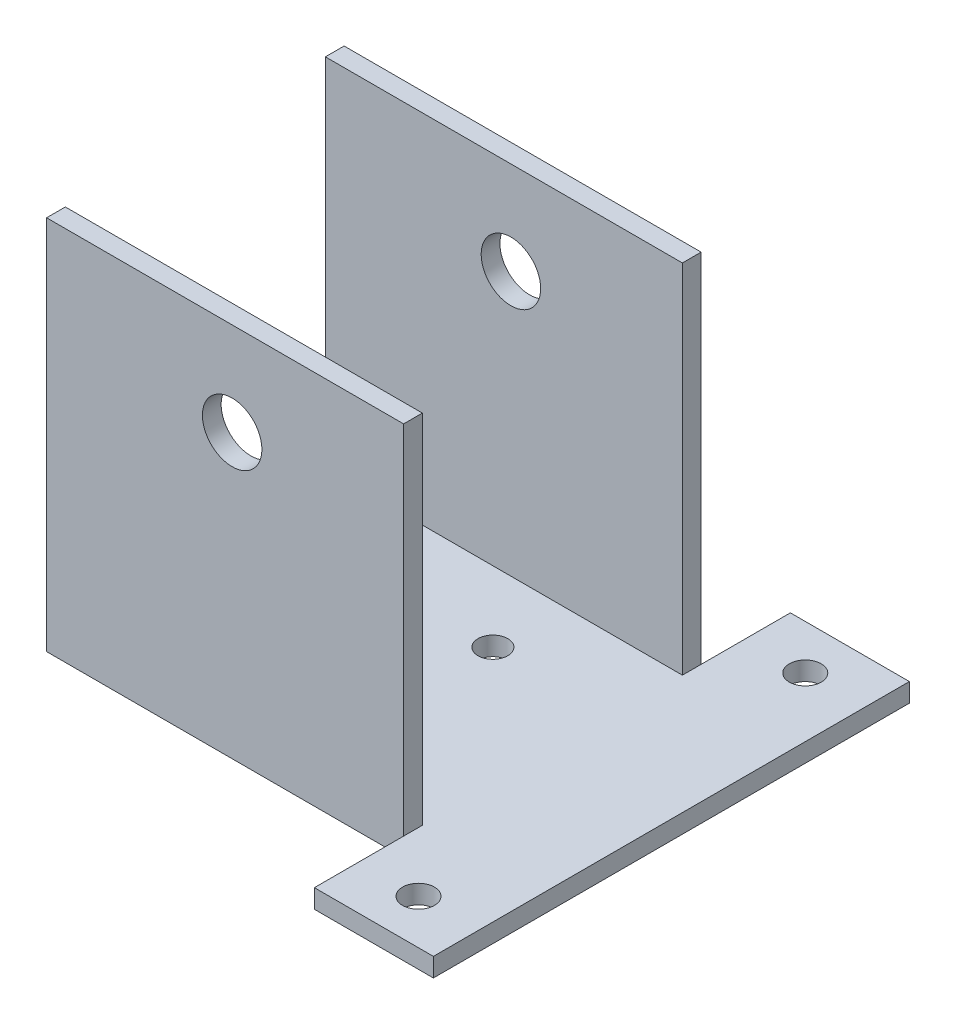
ISO-10303-21;
HEADER;
FILE_DESCRIPTION(('STEP AP214'),'2;1');
FILE_NAME('part.step','',(''),(''),'','','');
FILE_SCHEMA(('AUTOMOTIVE_DESIGN { 1 0 10303 214 1 1 1 1 }'));
ENDSEC;
DATA;
#1=APPLICATION_CONTEXT('core data for automotive mechanical design processes');
#2=APPLICATION_PROTOCOL_DEFINITION('international standard','automotive_design',2000,#1);
#3=PRODUCT_CONTEXT('',#1,'mechanical');
#4=PRODUCT('Part','Part','',(#3));
#5=PRODUCT_RELATED_PRODUCT_CATEGORY('part','',(#4));
#6=PRODUCT_DEFINITION_FORMATION('','',#4);
#7=PRODUCT_DEFINITION_CONTEXT('part definition',#1,'design');
#8=PRODUCT_DEFINITION('design','',#6,#7);
#9=PRODUCT_DEFINITION_SHAPE('','',#8);
#10=(LENGTH_UNIT() NAMED_UNIT(*) SI_UNIT(.MILLI.,.METRE.));
#11=(NAMED_UNIT(*) PLANE_ANGLE_UNIT() SI_UNIT($,.RADIAN.));
#12=(NAMED_UNIT(*) SI_UNIT($,.STERADIAN.) SOLID_ANGLE_UNIT());
#13=UNCERTAINTY_MEASURE_WITH_UNIT(LENGTH_MEASURE(1.E-05),#10,'distance_accuracy_value','');
#14=(GEOMETRIC_REPRESENTATION_CONTEXT(3) GLOBAL_UNCERTAINTY_ASSIGNED_CONTEXT((#13)) GLOBAL_UNIT_ASSIGNED_CONTEXT((#10,
#11,#12)) REPRESENTATION_CONTEXT('',''));
#15=CARTESIAN_POINT('',(0.,0.,0.));
#16=DIRECTION('',(0.,0.,1.));
#17=DIRECTION('',(1.,0.,0.));
#18=AXIS2_PLACEMENT_3D('',#15,#16,#17);
#19=CARTESIAN_POINT('',(0.,2.,0.));
#20=DIRECTION('',(0.,-1.,0.));
#21=DIRECTION('',(0.,0.,-1.));
#22=AXIS2_PLACEMENT_3D('',#19,#20,#21);
#23=PLANE('',#22);
#24=CARTESIAN_POINT('',(19.05,2.,-20.6375));
#25=DIRECTION('',(0.,1.,0.));
#26=DIRECTION('',(0.,0.,1.));
#27=AXIS2_PLACEMENT_3D('',#24,#25,#26);
#28=CIRCLE('',#27,1.7);
#29=CARTESIAN_POINT('',(19.05,2.,-18.9375));
#30=VERTEX_POINT('',#29);
#31=EDGE_CURVE('E248',#30,#30,#28,.T.);
#32=ORIENTED_EDGE('',*,*,#31,.F.);
#33=EDGE_LOOP('',(#32));
#34=FACE_BOUND('',#33,.T.);
#35=CARTESIAN_POINT('',(19.05,2.,20.6375));
#36=DIRECTION('',(0.,1.,0.));
#37=DIRECTION('',(0.,0.,1.));
#38=AXIS2_PLACEMENT_3D('',#35,#36,#37);
#39=CIRCLE('',#38,1.7);
#40=CARTESIAN_POINT('',(19.05,2.,22.3375));
#41=VERTEX_POINT('',#40);
#42=EDGE_CURVE('E240',#41,#41,#39,.T.);
#43=ORIENTED_EDGE('',*,*,#42,.F.);
#44=EDGE_LOOP('',(#43));
#45=FACE_BOUND('',#44,.T.);
#46=CARTESIAN_POINT('',(0.,2.,-6.35));
#47=DIRECTION('',(0.,1.,0.));
#48=DIRECTION('',(0.,0.,1.));
#49=AXIS2_PLACEMENT_3D('',#46,#47,#48);
#50=CIRCLE('',#49,1.5875);
#51=CARTESIAN_POINT('',(0.,2.,-4.7625));
#52=VERTEX_POINT('',#51);
#53=EDGE_CURVE('E232',#52,#52,#50,.T.);
#54=ORIENTED_EDGE('',*,*,#53,.F.);
#55=EDGE_LOOP('',(#54));
#56=FACE_BOUND('',#55,.T.);
#57=CARTESIAN_POINT('',(0.,2.,6.35));
#58=DIRECTION('',(0.,1.,0.));
#59=DIRECTION('',(0.,0.,1.));
#60=AXIS2_PLACEMENT_3D('',#57,#58,#59);
#61=CIRCLE('',#60,1.5875);
#62=CARTESIAN_POINT('',(0.,2.,7.9375));
#63=VERTEX_POINT('',#62);
#64=EDGE_CURVE('E224',#63,#63,#61,.T.);
#65=ORIENTED_EDGE('',*,*,#64,.F.);
#66=EDGE_LOOP('',(#65));
#67=FACE_BOUND('',#66,.T.);
#68=DIRECTION('',(0.,0.,-1.));
#69=VECTOR('',#68,1.);
#70=CARTESIAN_POINT('',(12.7,2.,15.875));
#71=LINE('',#70,#69);
#72=CARTESIAN_POINT('',(12.7,2.,15.875));
#73=VERTEX_POINT('',#72);
#74=CARTESIAN_POINT('',(12.7,2.,13.875));
#75=VERTEX_POINT('',#74);
#76=EDGE_CURVE('E168',#73,#75,#71,.T.);
#77=ORIENTED_EDGE('',*,*,#76,.F.);
#78=DIRECTION('',(0.,0.,1.));
#79=VECTOR('',#78,1.);
#80=CARTESIAN_POINT('',(12.7,2.,25.4));
#81=LINE('',#80,#79);
#82=CARTESIAN_POINT('',(12.7,2.,25.4));
#83=VERTEX_POINT('',#82);
#84=EDGE_CURVE('E266',#73,#83,#81,.T.);
#85=ORIENTED_EDGE('',*,*,#84,.T.);
#86=DIRECTION('',(1.,0.,0.));
#87=VECTOR('',#86,1.);
#88=CARTESIAN_POINT('',(25.4,2.,25.4));
#89=LINE('',#88,#87);
#90=CARTESIAN_POINT('',(25.4,2.,25.4));
#91=VERTEX_POINT('',#90);
#92=EDGE_CURVE('E269',#83,#91,#89,.T.);
#93=ORIENTED_EDGE('',*,*,#92,.T.);
#94=DIRECTION('',(0.,0.,-1.));
#95=VECTOR('',#94,1.);
#96=CARTESIAN_POINT('',(25.4,2.,-25.4));
#97=LINE('',#96,#95);
#98=CARTESIAN_POINT('',(25.4,2.,-25.4));
#99=VERTEX_POINT('',#98);
#100=EDGE_CURVE('E272',#91,#99,#97,.T.);
#101=ORIENTED_EDGE('',*,*,#100,.T.);
#102=DIRECTION('',(-1.,0.,0.));
#103=VECTOR('',#102,1.);
#104=CARTESIAN_POINT('',(12.7,2.,-25.4));
#105=LINE('',#104,#103);
#106=CARTESIAN_POINT('',(12.7,2.,-25.4));
#107=VERTEX_POINT('',#106);
#108=EDGE_CURVE('E256',#99,#107,#105,.T.);
#109=ORIENTED_EDGE('',*,*,#108,.T.);
#110=DIRECTION('',(0.,0.,1.));
#111=VECTOR('',#110,1.);
#112=CARTESIAN_POINT('',(12.7,2.,-15.875));
#113=LINE('',#112,#111);
#114=CARTESIAN_POINT('',(12.7,2.,-15.875));
#115=VERTEX_POINT('',#114);
#116=EDGE_CURVE('E260',#107,#115,#113,.T.);
#117=ORIENTED_EDGE('',*,*,#116,.T.);
#118=DIRECTION('',(0.,0.,-1.));
#119=VECTOR('',#118,1.);
#120=CARTESIAN_POINT('',(12.7,2.,-15.875));
#121=LINE('',#120,#119);
#122=CARTESIAN_POINT('',(12.7,2.,-13.875));
#123=VERTEX_POINT('',#122);
#124=EDGE_CURVE('E195',#123,#115,#121,.T.);
#125=ORIENTED_EDGE('',*,*,#124,.F.);
#126=DIRECTION('',(1.,0.,0.));
#127=VECTOR('',#126,1.);
#128=CARTESIAN_POINT('',(-25.4,2.,-13.875));
#129=LINE('',#128,#127);
#130=CARTESIAN_POINT('',(-25.4,2.,-13.875));
#131=VERTEX_POINT('',#130);
#132=EDGE_CURVE('E189',#131,#123,#129,.T.);
#133=ORIENTED_EDGE('',*,*,#132,.F.);
#134=DIRECTION('',(0.,0.,1.));
#135=VECTOR('',#134,1.);
#136=CARTESIAN_POINT('',(-25.4,2.,15.875));
#137=LINE('',#136,#135);
#138=CARTESIAN_POINT('',(-25.4,2.,13.875));
#139=VERTEX_POINT('',#138);
#140=EDGE_CURVE('E61',#131,#139,#137,.T.);
#141=ORIENTED_EDGE('',*,*,#140,.T.);
#142=DIRECTION('',(-1.,0.,0.));
#143=VECTOR('',#142,1.);
#144=CARTESIAN_POINT('',(-25.4,2.,13.875));
#145=LINE('',#144,#143);
#146=EDGE_CURVE('E56',#75,#139,#145,.T.);
#147=ORIENTED_EDGE('',*,*,#146,.F.);
#148=EDGE_LOOP('',(#77,#85,#93,#101,#109,#117,#125,#133,#141,#147));
#149=FACE_BOUND('',#148,.T.);
#150=ADVANCED_FACE('F39',(#34,#45,#56,#67,#149),#23,.F.);
#151=CARTESIAN_POINT('',(0.,0.,0.));
#152=DIRECTION('',(0.,-1.,0.));
#153=DIRECTION('',(0.,0.,-1.));
#154=AXIS2_PLACEMENT_3D('',#151,#152,#153);
#155=PLANE('',#154);
#156=CARTESIAN_POINT('',(0.,0.,-6.35));
#157=DIRECTION('',(0.,1.,0.));
#158=DIRECTION('',(0.,0.,1.));
#159=AXIS2_PLACEMENT_3D('',#156,#157,#158);
#160=CIRCLE('',#159,1.5875);
#161=CARTESIAN_POINT('',(0.,0.,-4.7625));
#162=VERTEX_POINT('',#161);
#163=EDGE_CURVE('E228',#162,#162,#160,.T.);
#164=ORIENTED_EDGE('',*,*,#163,.T.);
#165=EDGE_LOOP('',(#164));
#166=FACE_BOUND('',#165,.T.);
#167=CARTESIAN_POINT('',(19.05,0.,-20.6375));
#168=DIRECTION('',(0.,1.,0.));
#169=DIRECTION('',(0.,0.,1.));
#170=AXIS2_PLACEMENT_3D('',#167,#168,#169);
#171=CIRCLE('',#170,1.7);
#172=CARTESIAN_POINT('',(19.05,0.,-18.9375));
#173=VERTEX_POINT('',#172);
#174=EDGE_CURVE('E244',#173,#173,#171,.T.);
#175=ORIENTED_EDGE('',*,*,#174,.T.);
#176=EDGE_LOOP('',(#175));
#177=FACE_BOUND('',#176,.T.);
#178=DIRECTION('',(-1.,0.,0.));
#179=VECTOR('',#178,1.);
#180=CARTESIAN_POINT('',(12.7,0.,-25.4));
#181=LINE('',#180,#179);
#182=CARTESIAN_POINT('',(25.4,0.,-25.4));
#183=VERTEX_POINT('',#182);
#184=CARTESIAN_POINT('',(12.7,0.,-25.4));
#185=VERTEX_POINT('',#184);
#186=EDGE_CURVE('E252',#183,#185,#181,.T.);
#187=ORIENTED_EDGE('',*,*,#186,.F.);
#188=DIRECTION('',(0.,0.,-1.));
#189=VECTOR('',#188,1.);
#190=CARTESIAN_POINT('',(25.4,0.,-25.4));
#191=LINE('',#190,#189);
#192=CARTESIAN_POINT('',(25.4,0.,25.4));
#193=VERTEX_POINT('',#192);
#194=EDGE_CURVE('E261',#193,#183,#191,.T.);
#195=ORIENTED_EDGE('',*,*,#194,.F.);
#196=DIRECTION('',(1.,0.,0.));
#197=VECTOR('',#196,1.);
#198=CARTESIAN_POINT('',(25.4,0.,25.4));
#199=LINE('',#198,#197);
#200=CARTESIAN_POINT('',(12.7,0.,25.4));
#201=VERTEX_POINT('',#200);
#202=EDGE_CURVE('E293',#201,#193,#199,.T.);
#203=ORIENTED_EDGE('',*,*,#202,.F.);
#204=DIRECTION('',(0.,0.,1.));
#205=VECTOR('',#204,1.);
#206=CARTESIAN_POINT('',(12.7,0.,25.4));
#207=LINE('',#206,#205);
#208=CARTESIAN_POINT('',(12.7,0.,15.875));
#209=VERTEX_POINT('',#208);
#210=EDGE_CURVE('E290',#209,#201,#207,.T.);
#211=ORIENTED_EDGE('',*,*,#210,.F.);
#212=DIRECTION('',(1.,0.,0.));
#213=VECTOR('',#212,1.);
#214=CARTESIAN_POINT('',(12.7,0.,15.875));
#215=LINE('',#214,#213);
#216=CARTESIAN_POINT('',(-25.4,0.,15.875));
#217=VERTEX_POINT('',#216);
#218=EDGE_CURVE('E287',#217,#209,#215,.T.);
#219=ORIENTED_EDGE('',*,*,#218,.F.);
#220=DIRECTION('',(0.,0.,1.));
#221=VECTOR('',#220,1.);
#222=CARTESIAN_POINT('',(-25.4,0.,15.875));
#223=LINE('',#222,#221);
#224=CARTESIAN_POINT('',(-25.4,0.,-15.875));
#225=VERTEX_POINT('',#224);
#226=EDGE_CURVE('E143',#225,#217,#223,.T.);
#227=ORIENTED_EDGE('',*,*,#226,.F.);
#228=DIRECTION('',(-1.,0.,0.));
#229=VECTOR('',#228,1.);
#230=CARTESIAN_POINT('',(-25.4,0.,-15.875));
#231=LINE('',#230,#229);
#232=CARTESIAN_POINT('',(12.7,0.,-15.875));
#233=VERTEX_POINT('',#232);
#234=EDGE_CURVE('E282',#233,#225,#231,.T.);
#235=ORIENTED_EDGE('',*,*,#234,.F.);
#236=DIRECTION('',(0.,0.,1.));
#237=VECTOR('',#236,1.);
#238=CARTESIAN_POINT('',(12.7,0.,-15.875));
#239=LINE('',#238,#237);
#240=EDGE_CURVE('E279',#185,#233,#239,.T.);
#241=ORIENTED_EDGE('',*,*,#240,.F.);
#242=EDGE_LOOP('',(#187,#195,#203,#211,#219,#227,#235,#241));
#243=FACE_BOUND('',#242,.T.);
#244=CARTESIAN_POINT('',(19.05,0.,20.6375));
#245=DIRECTION('',(0.,1.,0.));
#246=DIRECTION('',(0.,0.,1.));
#247=AXIS2_PLACEMENT_3D('',#244,#245,#246);
#248=CIRCLE('',#247,1.7);
#249=CARTESIAN_POINT('',(19.05,0.,22.3375));
#250=VERTEX_POINT('',#249);
#251=EDGE_CURVE('E236',#250,#250,#248,.T.);
#252=ORIENTED_EDGE('',*,*,#251,.T.);
#253=EDGE_LOOP('',(#252));
#254=FACE_BOUND('',#253,.T.);
#255=CARTESIAN_POINT('',(0.,0.,6.35));
#256=DIRECTION('',(0.,1.,0.));
#257=DIRECTION('',(0.,0.,1.));
#258=AXIS2_PLACEMENT_3D('',#255,#256,#257);
#259=CIRCLE('',#258,1.5875);
#260=CARTESIAN_POINT('',(0.,0.,7.9375));
#261=VERTEX_POINT('',#260);
#262=EDGE_CURVE('E223',#261,#261,#259,.T.);
#263=ORIENTED_EDGE('',*,*,#262,.T.);
#264=EDGE_LOOP('',(#263));
#265=FACE_BOUND('',#264,.T.);
#266=ADVANCED_FACE('F325',(#166,#177,#243,#254,#265),#155,.T.);
#267=CARTESIAN_POINT('',(12.7,2.,-25.4));
#268=DIRECTION('',(0.,0.,1.));
#269=DIRECTION('',(1.,0.,0.));
#270=AXIS2_PLACEMENT_3D('',#267,#268,#269);
#271=PLANE('',#270);
#272=ORIENTED_EDGE('',*,*,#186,.T.);
#273=DIRECTION('',(0.,-1.,0.));
#274=VECTOR('',#273,1.);
#275=CARTESIAN_POINT('',(12.7,2.,-25.4));
#276=LINE('',#275,#274);
#277=EDGE_CURVE('E11',#107,#185,#276,.T.);
#278=ORIENTED_EDGE('',*,*,#277,.F.);
#279=ORIENTED_EDGE('',*,*,#108,.F.);
#280=DIRECTION('',(0.,-1.,0.));
#281=VECTOR('',#280,1.);
#282=CARTESIAN_POINT('',(25.4,2.,-25.4));
#283=LINE('',#282,#281);
#284=EDGE_CURVE('E275',#99,#183,#283,.T.);
#285=ORIENTED_EDGE('',*,*,#284,.T.);
#286=EDGE_LOOP('',(#272,#278,#279,#285));
#287=FACE_BOUND('',#286,.T.);
#288=ADVANCED_FACE('F41',(#287),#271,.F.);
#289=CARTESIAN_POINT('',(12.7,2.,-15.875));
#290=DIRECTION('',(1.,0.,0.));
#291=DIRECTION('',(0.,0.,-1.));
#292=AXIS2_PLACEMENT_3D('',#289,#290,#291);
#293=PLANE('',#292);
#294=ORIENTED_EDGE('',*,*,#240,.T.);
#295=DIRECTION('',(0.,-1.,0.));
#296=VECTOR('',#295,1.);
#297=CARTESIAN_POINT('',(12.7,2.,-15.875));
#298=LINE('',#297,#296);
#299=EDGE_CURVE('E49',#115,#233,#298,.T.);
#300=ORIENTED_EDGE('',*,*,#299,.F.);
#301=ORIENTED_EDGE('',*,*,#116,.F.);
#302=ORIENTED_EDGE('',*,*,#277,.T.);
#303=EDGE_LOOP('',(#294,#300,#301,#302));
#304=FACE_BOUND('',#303,.T.);
#305=ADVANCED_FACE('F351',(#304),#293,.F.);
#306=CARTESIAN_POINT('',(-25.4,2.,-15.875));
#307=DIRECTION('',(0.,0.,1.));
#308=DIRECTION('',(1.,0.,0.));
#309=AXIS2_PLACEMENT_3D('',#306,#307,#308);
#310=PLANE('',#309);
#311=CARTESIAN_POINT('',(-5.59999999999998,30.16795818,-15.875));
#312=DIRECTION('',(0.,0.,1.));
#313=DIRECTION('',(1.,0.,0.));
#314=AXIS2_PLACEMENT_3D('',#311,#312,#313);
#315=CIRCLE('',#314,3.175);
#316=CARTESIAN_POINT('',(-2.42499999999998,30.16795818,-15.875));
#317=VERTEX_POINT('',#316);
#318=EDGE_CURVE('E171',#317,#317,#315,.T.);
#319=ORIENTED_EDGE('',*,*,#318,.T.);
#320=EDGE_LOOP('',(#319));
#321=FACE_BOUND('',#320,.T.);
#322=ORIENTED_EDGE('',*,*,#234,.T.);
#323=DIRECTION('',(0.,-1.,0.));
#324=VECTOR('',#323,1.);
#325=CARTESIAN_POINT('',(-25.4,2.,-15.875));
#326=LINE('',#325,#324);
#327=CARTESIAN_POINT('',(-25.4,40.1,-15.875));
#328=VERTEX_POINT('',#327);
#329=EDGE_CURVE('E147',#328,#225,#326,.T.);
#330=ORIENTED_EDGE('',*,*,#329,.F.);
#331=DIRECTION('',(-1.,0.,0.));
#332=VECTOR('',#331,1.);
#333=CARTESIAN_POINT('',(-25.4,40.1,-15.875));
#334=LINE('',#333,#332);
#335=CARTESIAN_POINT('',(12.7,40.1,-15.875));
#336=VERTEX_POINT('',#335);
#337=EDGE_CURVE('E201',#336,#328,#334,.T.);
#338=ORIENTED_EDGE('',*,*,#337,.F.);
#339=DIRECTION('',(0.,-1.,0.));
#340=VECTOR('',#339,1.);
#341=CARTESIAN_POINT('',(12.7,40.1,-15.875));
#342=LINE('',#341,#340);
#343=EDGE_CURVE('E205',#336,#115,#342,.T.);
#344=ORIENTED_EDGE('',*,*,#343,.T.);
#345=ORIENTED_EDGE('',*,*,#299,.T.);
#346=EDGE_LOOP('',(#322,#330,#338,#344,#345));
#347=FACE_BOUND('',#346,.T.);
#348=ADVANCED_FACE('F319',(#321,#347),#310,.F.);
#349=CARTESIAN_POINT('',(-25.4,2.,15.875));
#350=DIRECTION('',(1.,0.,0.));
#351=DIRECTION('',(0.,0.,-1.));
#352=AXIS2_PLACEMENT_3D('',#349,#350,#351);
#353=PLANE('',#352);
#354=ORIENTED_EDGE('',*,*,#226,.T.);
#355=DIRECTION('',(0.,-1.,0.));
#356=VECTOR('',#355,1.);
#357=CARTESIAN_POINT('',(-25.4,2.,15.875));
#358=LINE('',#357,#356);
#359=CARTESIAN_POINT('',(-25.4,40.1,15.875));
#360=VERTEX_POINT('',#359);
#361=EDGE_CURVE('E135',#360,#217,#358,.T.);
#362=ORIENTED_EDGE('',*,*,#361,.F.);
#363=DIRECTION('',(0.,0.,1.));
#364=VECTOR('',#363,1.);
#365=CARTESIAN_POINT('',(-25.4,40.1,15.875));
#366=LINE('',#365,#364);
#367=CARTESIAN_POINT('',(-25.4,40.1,13.875));
#368=VERTEX_POINT('',#367);
#369=EDGE_CURVE('E140',#368,#360,#366,.T.);
#370=ORIENTED_EDGE('',*,*,#369,.F.);
#371=DIRECTION('',(0.,-1.,0.));
#372=VECTOR('',#371,1.);
#373=CARTESIAN_POINT('',(-25.4,40.1,13.875));
#374=LINE('',#373,#372);
#375=EDGE_CURVE('E178',#368,#139,#374,.T.);
#376=ORIENTED_EDGE('',*,*,#375,.T.);
#377=ORIENTED_EDGE('',*,*,#140,.F.);
#378=DIRECTION('',(0.,-1.,0.));
#379=VECTOR('',#378,1.);
#380=CARTESIAN_POINT('',(-25.4,40.1,-13.875));
#381=LINE('',#380,#379);
#382=CARTESIAN_POINT('',(-25.4,40.1,-13.875));
#383=VERTEX_POINT('',#382);
#384=EDGE_CURVE('E219',#383,#131,#381,.T.);
#385=ORIENTED_EDGE('',*,*,#384,.F.);
#386=DIRECTION('',(0.,0.,1.));
#387=VECTOR('',#386,1.);
#388=CARTESIAN_POINT('',(-25.4,40.1,-15.875));
#389=LINE('',#388,#387);
#390=EDGE_CURVE('E190',#328,#383,#389,.T.);
#391=ORIENTED_EDGE('',*,*,#390,.F.);
#392=ORIENTED_EDGE('',*,*,#329,.T.);
#393=EDGE_LOOP('',(#354,#362,#370,#376,#377,#385,#391,#392));
#394=FACE_BOUND('',#393,.T.);
#395=ADVANCED_FACE('F137',(#394),#353,.F.);
#396=CARTESIAN_POINT('',(12.7,2.,15.875));
#397=DIRECTION('',(0.,0.,-1.));
#398=DIRECTION('',(-1.,0.,0.));
#399=AXIS2_PLACEMENT_3D('',#396,#397,#398);
#400=PLANE('',#399);
#401=CARTESIAN_POINT('',(-5.59999999999998,30.16795818,15.875));
#402=DIRECTION('',(0.,0.,1.));
#403=DIRECTION('',(1.,0.,0.));
#404=AXIS2_PLACEMENT_3D('',#401,#402,#403);
#405=CIRCLE('',#404,3.175);
#406=CARTESIAN_POINT('',(-2.42499999999998,30.16795818,15.875));
#407=VERTEX_POINT('',#406);
#408=EDGE_CURVE('E428',#407,#407,#405,.T.);
#409=ORIENTED_EDGE('',*,*,#408,.F.);
#410=EDGE_LOOP('',(#409));
#411=FACE_BOUND('',#410,.T.);
#412=ORIENTED_EDGE('',*,*,#218,.T.);
#413=DIRECTION('',(0.,-1.,0.));
#414=VECTOR('',#413,1.);
#415=CARTESIAN_POINT('',(12.7,2.,15.875));
#416=LINE('',#415,#414);
#417=EDGE_CURVE('E148',#73,#209,#416,.T.);
#418=ORIENTED_EDGE('',*,*,#417,.F.);
#419=DIRECTION('',(0.,-1.,0.));
#420=VECTOR('',#419,1.);
#421=CARTESIAN_POINT('',(12.7,40.1,15.875));
#422=LINE('',#421,#420);
#423=CARTESIAN_POINT('',(12.7,40.1,15.875));
#424=VERTEX_POINT('',#423);
#425=EDGE_CURVE('E155',#424,#73,#422,.T.);
#426=ORIENTED_EDGE('',*,*,#425,.F.);
#427=DIRECTION('',(1.,0.,0.));
#428=VECTOR('',#427,1.);
#429=CARTESIAN_POINT('',(-25.4,40.1,15.875));
#430=LINE('',#429,#428);
#431=EDGE_CURVE('E151',#360,#424,#430,.T.);
#432=ORIENTED_EDGE('',*,*,#431,.F.);
#433=ORIENTED_EDGE('',*,*,#361,.T.);
#434=EDGE_LOOP('',(#412,#418,#426,#432,#433));
#435=FACE_BOUND('',#434,.T.);
#436=ADVANCED_FACE('F152',(#411,#435),#400,.F.);
#437=CARTESIAN_POINT('',(12.7,2.,25.4));
#438=DIRECTION('',(1.,0.,0.));
#439=DIRECTION('',(0.,0.,-1.));
#440=AXIS2_PLACEMENT_3D('',#437,#438,#439);
#441=PLANE('',#440);
#442=ORIENTED_EDGE('',*,*,#210,.T.);
#443=DIRECTION('',(0.,-1.,0.));
#444=VECTOR('',#443,1.);
#445=CARTESIAN_POINT('',(12.7,2.,25.4));
#446=LINE('',#445,#444);
#447=EDGE_CURVE('E305',#83,#201,#446,.T.);
#448=ORIENTED_EDGE('',*,*,#447,.F.);
#449=ORIENTED_EDGE('',*,*,#84,.F.);
#450=ORIENTED_EDGE('',*,*,#417,.T.);
#451=EDGE_LOOP('',(#442,#448,#449,#450));
#452=FACE_BOUND('',#451,.T.);
#453=ADVANCED_FACE('F330',(#452),#441,.F.);
#454=CARTESIAN_POINT('',(25.4,2.,25.4));
#455=DIRECTION('',(0.,0.,-1.));
#456=DIRECTION('',(-1.,0.,0.));
#457=AXIS2_PLACEMENT_3D('',#454,#455,#456);
#458=PLANE('',#457);
#459=ORIENTED_EDGE('',*,*,#202,.T.);
#460=DIRECTION('',(0.,-1.,0.));
#461=VECTOR('',#460,1.);
#462=CARTESIAN_POINT('',(25.4,2.,25.4));
#463=LINE('',#462,#461);
#464=EDGE_CURVE('E301',#91,#193,#463,.T.);
#465=ORIENTED_EDGE('',*,*,#464,.F.);
#466=ORIENTED_EDGE('',*,*,#92,.F.);
#467=ORIENTED_EDGE('',*,*,#447,.T.);
#468=EDGE_LOOP('',(#459,#465,#466,#467));
#469=FACE_BOUND('',#468,.T.);
#470=ADVANCED_FACE('F359',(#469),#458,.F.);
#471=CARTESIAN_POINT('',(25.4,2.,-25.4));
#472=DIRECTION('',(-1.,0.,0.));
#473=DIRECTION('',(0.,0.,1.));
#474=AXIS2_PLACEMENT_3D('',#471,#472,#473);
#475=PLANE('',#474);
#476=ORIENTED_EDGE('',*,*,#194,.T.);
#477=ORIENTED_EDGE('',*,*,#284,.F.);
#478=ORIENTED_EDGE('',*,*,#100,.F.);
#479=ORIENTED_EDGE('',*,*,#464,.T.);
#480=EDGE_LOOP('',(#476,#477,#478,#479));
#481=FACE_BOUND('',#480,.T.);
#482=ADVANCED_FACE('F356',(#481),#475,.F.);
#483=CARTESIAN_POINT('',(19.05,2.,-20.6375));
#484=DIRECTION('',(0.,-1.,0.));
#485=DIRECTION('',(0.,0.,-1.));
#486=AXIS2_PLACEMENT_3D('',#483,#484,#485);
#487=CYLINDRICAL_SURFACE('',#486,1.7);
#488=ORIENTED_EDGE('',*,*,#31,.T.);
#489=EDGE_LOOP('',(#488));
#490=FACE_BOUND('',#489,.T.);
#491=ORIENTED_EDGE('',*,*,#174,.F.);
#492=EDGE_LOOP('',(#491));
#493=FACE_BOUND('',#492,.T.);
#494=ADVANCED_FACE('F366',(#490,#493),#487,.F.);
#495=CARTESIAN_POINT('',(19.05,2.,20.6375));
#496=DIRECTION('',(0.,-1.,0.));
#497=DIRECTION('',(0.,0.,-1.));
#498=AXIS2_PLACEMENT_3D('',#495,#496,#497);
#499=CYLINDRICAL_SURFACE('',#498,1.7);
#500=ORIENTED_EDGE('',*,*,#42,.T.);
#501=EDGE_LOOP('',(#500));
#502=FACE_BOUND('',#501,.T.);
#503=ORIENTED_EDGE('',*,*,#251,.F.);
#504=EDGE_LOOP('',(#503));
#505=FACE_BOUND('',#504,.T.);
#506=ADVANCED_FACE('F382',(#502,#505),#499,.F.);
#507=CARTESIAN_POINT('',(0.,2.,-6.35));
#508=DIRECTION('',(0.,-1.,0.));
#509=DIRECTION('',(0.,0.,-1.));
#510=AXIS2_PLACEMENT_3D('',#507,#508,#509);
#511=CYLINDRICAL_SURFACE('',#510,1.5875);
#512=ORIENTED_EDGE('',*,*,#53,.T.);
#513=EDGE_LOOP('',(#512));
#514=FACE_BOUND('',#513,.T.);
#515=ORIENTED_EDGE('',*,*,#163,.F.);
#516=EDGE_LOOP('',(#515));
#517=FACE_BOUND('',#516,.T.);
#518=ADVANCED_FACE('F386',(#514,#517),#511,.F.);
#519=CARTESIAN_POINT('',(0.,2.,6.35));
#520=DIRECTION('',(0.,-1.,0.));
#521=DIRECTION('',(0.,0.,-1.));
#522=AXIS2_PLACEMENT_3D('',#519,#520,#521);
#523=CYLINDRICAL_SURFACE('',#522,1.5875);
#524=ORIENTED_EDGE('',*,*,#64,.T.);
#525=EDGE_LOOP('',(#524));
#526=FACE_BOUND('',#525,.T.);
#527=ORIENTED_EDGE('',*,*,#262,.F.);
#528=EDGE_LOOP('',(#527));
#529=FACE_BOUND('',#528,.T.);
#530=ADVANCED_FACE('F390',(#526,#529),#523,.F.);
#531=CARTESIAN_POINT('',(-25.4,40.1,-13.875));
#532=DIRECTION('',(0.,0.,-1.));
#533=DIRECTION('',(-1.,0.,0.));
#534=AXIS2_PLACEMENT_3D('',#531,#532,#533);
#535=PLANE('',#534);
#536=CARTESIAN_POINT('',(-5.59999999999998,30.16795818,-13.875));
#537=DIRECTION('',(0.,0.,-1.));
#538=DIRECTION('',(-1.,0.,0.));
#539=AXIS2_PLACEMENT_3D('',#536,#537,#538);
#540=CIRCLE('',#539,3.175);
#541=CARTESIAN_POINT('',(-8.77499999999998,30.16795818,-13.875));
#542=VERTEX_POINT('',#541);
#543=EDGE_CURVE('E420',#542,#542,#540,.T.);
#544=ORIENTED_EDGE('',*,*,#543,.T.);
#545=EDGE_LOOP('',(#544));
#546=FACE_BOUND('',#545,.T.);
#547=ORIENTED_EDGE('',*,*,#132,.T.);
#548=DIRECTION('',(0.,-1.,0.));
#549=VECTOR('',#548,1.);
#550=CARTESIAN_POINT('',(12.7,40.1,-13.875));
#551=LINE('',#550,#549);
#552=CARTESIAN_POINT('',(12.7,40.1,-13.875));
#553=VERTEX_POINT('',#552);
#554=EDGE_CURVE('E215',#553,#123,#551,.T.);
#555=ORIENTED_EDGE('',*,*,#554,.F.);
#556=DIRECTION('',(1.,0.,0.));
#557=VECTOR('',#556,1.);
#558=CARTESIAN_POINT('',(-25.4,40.1,-13.875));
#559=LINE('',#558,#557);
#560=EDGE_CURVE('E194',#383,#553,#559,.T.);
#561=ORIENTED_EDGE('',*,*,#560,.F.);
#562=ORIENTED_EDGE('',*,*,#384,.T.);
#563=EDGE_LOOP('',(#547,#555,#561,#562));
#564=FACE_BOUND('',#563,.T.);
#565=ADVANCED_FACE('F342',(#546,#564),#535,.F.);
#566=CARTESIAN_POINT('',(12.7,40.1,-15.875));
#567=DIRECTION('',(-1.,0.,0.));
#568=DIRECTION('',(0.,0.,1.));
#569=AXIS2_PLACEMENT_3D('',#566,#567,#568);
#570=PLANE('',#569);
#571=ORIENTED_EDGE('',*,*,#124,.T.);
#572=ORIENTED_EDGE('',*,*,#343,.F.);
#573=DIRECTION('',(0.,0.,-1.));
#574=VECTOR('',#573,1.);
#575=CARTESIAN_POINT('',(12.7,40.1,-15.875));
#576=LINE('',#575,#574);
#577=EDGE_CURVE('E198',#553,#336,#576,.T.);
#578=ORIENTED_EDGE('',*,*,#577,.F.);
#579=ORIENTED_EDGE('',*,*,#554,.T.);
#580=EDGE_LOOP('',(#571,#572,#578,#579));
#581=FACE_BOUND('',#580,.T.);
#582=ADVANCED_FACE('F348',(#581),#570,.F.);
#583=CARTESIAN_POINT('',(0.,40.1,0.));
#584=DIRECTION('',(0.,1.,0.));
#585=DIRECTION('',(0.,0.,1.));
#586=AXIS2_PLACEMENT_3D('',#583,#584,#585);
#587=PLANE('',#586);
#588=ORIENTED_EDGE('',*,*,#390,.T.);
#589=ORIENTED_EDGE('',*,*,#560,.T.);
#590=ORIENTED_EDGE('',*,*,#577,.T.);
#591=ORIENTED_EDGE('',*,*,#337,.T.);
#592=EDGE_LOOP('',(#588,#589,#590,#591));
#593=FACE_BOUND('',#592,.T.);
#594=ADVANCED_FACE('F346',(#593),#587,.T.);
#595=CARTESIAN_POINT('',(12.7,40.1,15.875));
#596=DIRECTION('',(-1.,0.,0.));
#597=DIRECTION('',(0.,0.,1.));
#598=AXIS2_PLACEMENT_3D('',#595,#596,#597);
#599=PLANE('',#598);
#600=ORIENTED_EDGE('',*,*,#76,.T.);
#601=DIRECTION('',(0.,-1.,0.));
#602=VECTOR('',#601,1.);
#603=CARTESIAN_POINT('',(12.7,40.1,13.875));
#604=LINE('',#603,#602);
#605=CARTESIAN_POINT('',(12.7,40.1,13.875));
#606=VERTEX_POINT('',#605);
#607=EDGE_CURVE('E183',#606,#75,#604,.T.);
#608=ORIENTED_EDGE('',*,*,#607,.F.);
#609=DIRECTION('',(0.,0.,-1.));
#610=VECTOR('',#609,1.);
#611=CARTESIAN_POINT('',(12.7,40.1,15.875));
#612=LINE('',#611,#610);
#613=EDGE_CURVE('E159',#424,#606,#612,.T.);
#614=ORIENTED_EDGE('',*,*,#613,.F.);
#615=ORIENTED_EDGE('',*,*,#425,.T.);
#616=EDGE_LOOP('',(#600,#608,#614,#615));
#617=FACE_BOUND('',#616,.T.);
#618=ADVANCED_FACE('F336',(#617),#599,.F.);
#619=CARTESIAN_POINT('',(-25.4,40.1,13.875));
#620=DIRECTION('',(0.,0.,1.));
#621=DIRECTION('',(1.,0.,0.));
#622=AXIS2_PLACEMENT_3D('',#619,#620,#621);
#623=PLANE('',#622);
#624=CARTESIAN_POINT('',(-5.59999999999998,30.16795818,13.875));
#625=DIRECTION('',(0.,0.,1.));
#626=DIRECTION('',(1.,0.,0.));
#627=AXIS2_PLACEMENT_3D('',#624,#625,#626);
#628=CIRCLE('',#627,3.175);
#629=CARTESIAN_POINT('',(-2.42499999999998,30.16795818,13.875));
#630=VERTEX_POINT('',#629);
#631=EDGE_CURVE('E43',#630,#630,#628,.T.);
#632=ORIENTED_EDGE('',*,*,#631,.T.);
#633=EDGE_LOOP('',(#632));
#634=FACE_BOUND('',#633,.T.);
#635=ORIENTED_EDGE('',*,*,#146,.T.);
#636=ORIENTED_EDGE('',*,*,#375,.F.);
#637=DIRECTION('',(-1.,0.,0.));
#638=VECTOR('',#637,1.);
#639=CARTESIAN_POINT('',(-25.4,40.1,13.875));
#640=LINE('',#639,#638);
#641=EDGE_CURVE('E163',#606,#368,#640,.T.);
#642=ORIENTED_EDGE('',*,*,#641,.F.);
#643=ORIENTED_EDGE('',*,*,#607,.T.);
#644=EDGE_LOOP('',(#635,#636,#642,#643));
#645=FACE_BOUND('',#644,.T.);
#646=ADVANCED_FACE('F338',(#634,#645),#623,.F.);
#647=CARTESIAN_POINT('',(0.,40.1,0.));
#648=DIRECTION('',(0.,-1.,0.));
#649=DIRECTION('',(0.,0.,-1.));
#650=AXIS2_PLACEMENT_3D('',#647,#648,#649);
#651=PLANE('',#650);
#652=ORIENTED_EDGE('',*,*,#369,.T.);
#653=ORIENTED_EDGE('',*,*,#431,.T.);
#654=ORIENTED_EDGE('',*,*,#613,.T.);
#655=ORIENTED_EDGE('',*,*,#641,.T.);
#656=EDGE_LOOP('',(#652,#653,#654,#655));
#657=FACE_BOUND('',#656,.T.);
#658=ADVANCED_FACE('F161',(#657),#651,.F.);
#659=CARTESIAN_POINT('',(-5.59999999999998,30.16795818,-25.4));
#660=DIRECTION('',(0.,0.,1.));
#661=DIRECTION('',(1.,0.,0.));
#662=AXIS2_PLACEMENT_3D('',#659,#660,#661);
#663=CYLINDRICAL_SURFACE('',#662,3.175);
#664=ORIENTED_EDGE('',*,*,#408,.T.);
#665=EDGE_LOOP('',(#664));
#666=FACE_BOUND('',#665,.T.);
#667=ORIENTED_EDGE('',*,*,#631,.F.);
#668=EDGE_LOOP('',(#667));
#669=FACE_BOUND('',#668,.T.);
#670=ADVANCED_FACE('F409',(#666,#669),#663,.F.);
#671=ORIENTED_EDGE('',*,*,#543,.F.);
#672=EDGE_LOOP('',(#671));
#673=FACE_BOUND('',#672,.T.);
#674=ORIENTED_EDGE('',*,*,#318,.F.);
#675=EDGE_LOOP('',(#674));
#676=FACE_BOUND('',#675,.T.);
#677=ADVANCED_FACE('F410',(#673,#676),#663,.F.);
#678=CLOSED_SHELL('',(#150,#266,#288,#305,#348,#395,#436,#453,#470,#482,#494,#506,#518,#530,
#565,#582,#594,#618,#646,#658,#670,#677));
#679=MANIFOLD_SOLID_BREP('B2',#678);
#680=ADVANCED_BREP_SHAPE_REPRESENTATION('',(#18,#679),#14);
#681=SHAPE_DEFINITION_REPRESENTATION(#9,#680);
ENDSEC;
END-ISO-10303-21;
